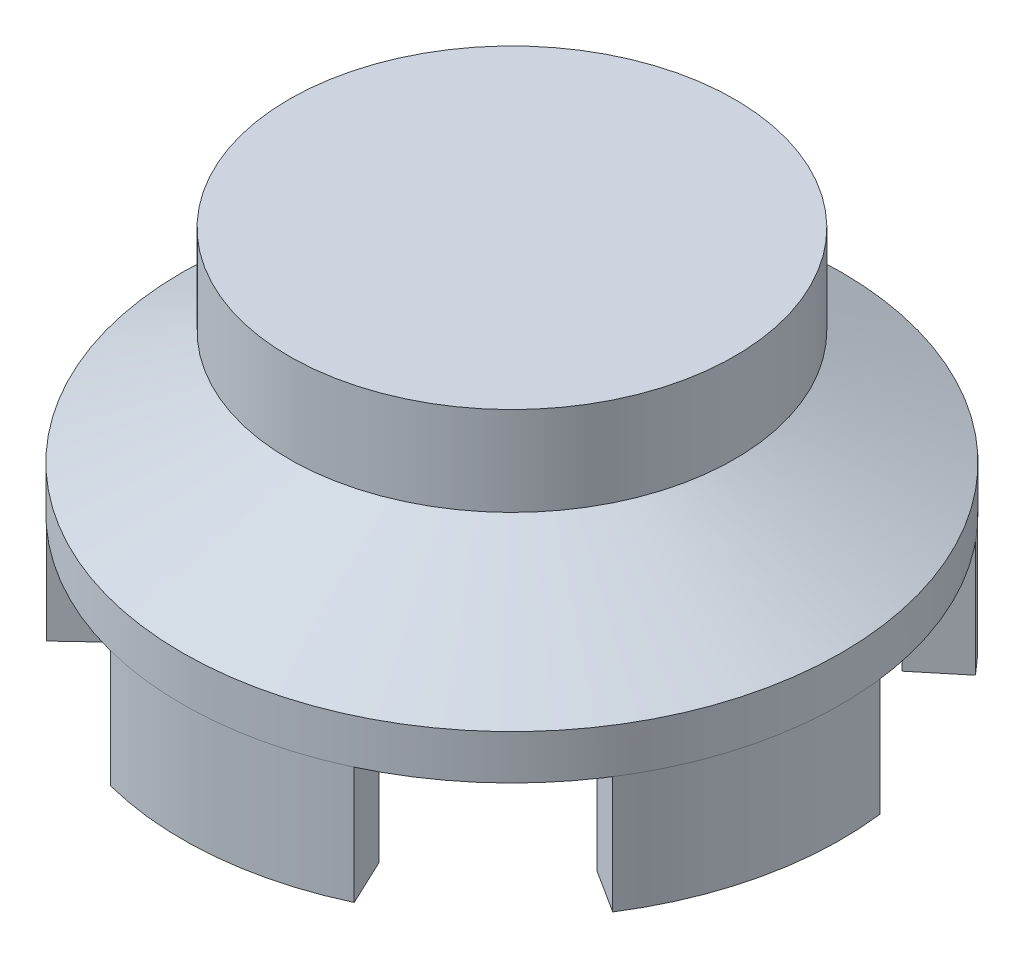
ISO-10303-21;
HEADER;
FILE_DESCRIPTION(('STEP AP214'),'2;1');
FILE_NAME('part.step','',(''),(''),'','','');
FILE_SCHEMA(('AUTOMOTIVE_DESIGN { 1 0 10303 214 1 1 1 1 }'));
ENDSEC;
DATA;
#1=APPLICATION_CONTEXT('core data for automotive mechanical design processes');
#2=APPLICATION_PROTOCOL_DEFINITION('international standard','automotive_design',2000,#1);
#3=PRODUCT_CONTEXT('',#1,'mechanical');
#4=PRODUCT('Part','Part','',(#3));
#5=PRODUCT_RELATED_PRODUCT_CATEGORY('part','',(#4));
#6=PRODUCT_DEFINITION_FORMATION('','',#4);
#7=PRODUCT_DEFINITION_CONTEXT('part definition',#1,'design');
#8=PRODUCT_DEFINITION('design','',#6,#7);
#9=PRODUCT_DEFINITION_SHAPE('','',#8);
#10=(LENGTH_UNIT() NAMED_UNIT(*) SI_UNIT(.MILLI.,.METRE.));
#11=(NAMED_UNIT(*) PLANE_ANGLE_UNIT() SI_UNIT($,.RADIAN.));
#12=(NAMED_UNIT(*) SI_UNIT($,.STERADIAN.) SOLID_ANGLE_UNIT());
#13=UNCERTAINTY_MEASURE_WITH_UNIT(LENGTH_MEASURE(1.E-05),#10,'distance_accuracy_value','');
#14=(GEOMETRIC_REPRESENTATION_CONTEXT(3) GLOBAL_UNCERTAINTY_ASSIGNED_CONTEXT((#13)) GLOBAL_UNIT_ASSIGNED_CONTEXT((#10,
#11,#12)) REPRESENTATION_CONTEXT('',''));
#15=CARTESIAN_POINT('',(0.,0.,0.));
#16=DIRECTION('',(0.,0.,1.));
#17=DIRECTION('',(1.,0.,0.));
#18=AXIS2_PLACEMENT_3D('',#15,#16,#17);
#19=CARTESIAN_POINT('',(15.5,-2.75793650793651,0.));
#20=DIRECTION('',(0.,1.,0.));
#21=DIRECTION('',(-1.,0.,0.));
#22=AXIS2_PLACEMENT_3D('',#19,#20,#21);
#23=PLANE('',#22);
#24=CARTESIAN_POINT('',(0.,-2.75793650793651,0.));
#25=DIRECTION('',(0.,1.,0.));
#26=DIRECTION('',(-1.,0.,0.));
#27=AXIS2_PLACEMENT_3D('',#24,#25,#26);
#28=CIRCLE('',#27,18.4844813235458);
#29=CARTESIAN_POINT('',(-16.1987932347149,-2.75793650793651,-8.90365922188551));
#30=VERTEX_POINT('',#29);
#31=CARTESIAN_POINT('',(-6.77439666234866,-2.75793650793651,-17.1983603771311));
#32=VERTEX_POINT('',#31);
#33=EDGE_CURVE('E336',#30,#32,#28,.F.);
#34=ORIENTED_EDGE('',*,*,#33,.F.);
#35=DIRECTION('',(-0.87634556529756,0.,-0.481682935324991));
#36=VECTOR('',#35,1.);
#37=CARTESIAN_POINT('',(11.9037140221589,-2.75793650793651,6.54287091589929));
#38=LINE('',#37,#36);
#39=CARTESIAN_POINT('',(-13.6383140461064,-2.75793650793651,-7.49629301813378));
#40=VERTEX_POINT('',#39);
#41=EDGE_CURVE('E327',#40,#30,#38,.T.);
#42=ORIENTED_EDGE('',*,*,#41,.F.);
#43=CARTESIAN_POINT('',(0.,-2.75793650793651,0.));
#44=DIRECTION('',(0.,1.,0.));
#45=DIRECTION('',(-1.,0.,0.));
#46=AXIS2_PLACEMENT_3D('',#43,#44,#45);
#47=CIRCLE('',#46,15.5627124574717);
#48=CARTESIAN_POINT('',(-5.70359457123055,-2.75793650793651,-14.4798835631014));
#49=VERTEX_POINT('',#48);
#50=EDGE_CURVE('E330',#49,#40,#47,.T.);
#51=ORIENTED_EDGE('',*,*,#50,.F.);
#52=DIRECTION('',(0.366491033411867,0.,0.930421583170071));
#53=VECTOR('',#52,1.);
#54=CARTESIAN_POINT('',(2.08189300235512,-2.75793650793651,5.28536309663293));
#55=LINE('',#54,#53);
#56=EDGE_CURVE('E333',#32,#49,#55,.T.);
#57=ORIENTED_EDGE('',*,*,#56,.F.);
#58=EDGE_LOOP('',(#34,#42,#51,#57));
#59=FACE_BOUND('',#58,.T.);
#60=CARTESIAN_POINT('',(0.,-2.75793650793651,0.));
#61=DIRECTION('',(0.,1.,0.));
#62=DIRECTION('',(-1.,0.,0.));
#63=AXIS2_PLACEMENT_3D('',#60,#61,#62);
#64=CIRCLE('',#63,18.4844813235458);
#65=CARTESIAN_POINT('',(18.3385385973125,-2.75793650793651,-2.31820014567192));
#66=VERTEX_POINT('',#65);
#67=CARTESIAN_POINT('',(15.5895446197659,-2.75793650793651,9.93187536917588));
#68=VERTEX_POINT('',#67);
#69=EDGE_CURVE('E312',#66,#68,#64,.F.);
#70=ORIENTED_EDGE('',*,*,#69,.F.);
#71=DIRECTION('',(0.992104580935825,0.,-0.12541331861549));
#72=VECTOR('',#71,1.);
#73=CARTESIAN_POINT('',(15.2562082424647,-2.75793650793651,-1.92855848258627));
#74=LINE('',#73,#72);
#75=CARTESIAN_POINT('',(15.4398383208447,-2.75793650793651,-1.95177141595016));
#76=VERTEX_POINT('',#75);
#77=EDGE_CURVE('E303',#76,#66,#74,.T.);
#78=ORIENTED_EDGE('',*,*,#77,.F.);
#79=CARTESIAN_POINT('',(0.,-2.75793650793651,0.));
#80=DIRECTION('',(0.,1.,0.));
#81=DIRECTION('',(-1.,0.,0.));
#82=AXIS2_PLACEMENT_3D('',#79,#80,#81);
#83=CIRCLE('',#82,15.5627124574717);
#84=CARTESIAN_POINT('',(13.1253669504534,-2.75793650793651,8.36198310509478));
#85=VERTEX_POINT('',#84);
#86=EDGE_CURVE('E306',#85,#76,#83,.T.);
#87=ORIENTED_EDGE('',*,*,#86,.F.);
#88=DIRECTION('',(-0.84338555931822,0.,-0.537308848180907));
#89=VECTOR('',#88,1.);
#90=CARTESIAN_POINT('',(11.0251376258309,-2.75793650793651,7.02395711347009));
#91=LINE('',#90,#89);
#92=EDGE_CURVE('E309',#68,#85,#91,.T.);
#93=ORIENTED_EDGE('',*,*,#92,.F.);
#94=EDGE_LOOP('',(#70,#78,#87,#93));
#95=FACE_BOUND('',#94,.T.);
#96=CARTESIAN_POINT('',(0.,-2.75793650793651,0.));
#97=DIRECTION('',(0.,1.,0.));
#98=DIRECTION('',(-1.,0.,0.));
#99=AXIS2_PLACEMENT_3D('',#96,#97,#98);
#100=CIRCLE('',#99,15.5);
#101=CARTESIAN_POINT('',(15.5,-2.75793650793651,0.));
#102=VERTEX_POINT('',#101);
#103=EDGE_CURVE('E285',#102,#102,#100,.T.);
#104=ORIENTED_EDGE('',*,*,#103,.T.);
#105=EDGE_LOOP('',(#104));
#106=FACE_BOUND('',#105,.T.);
#107=CARTESIAN_POINT('',(0.,-2.75793650793651,0.));
#108=DIRECTION('',(0.,1.,0.));
#109=DIRECTION('',(-1.,0.,0.));
#110=AXIS2_PLACEMENT_3D('',#107,#108,#109);
#111=CIRCLE('',#110,18.5);
#112=CARTESIAN_POINT('',(-18.5,-2.75793650793651,0.));
#113=VERTEX_POINT('',#112);
#114=EDGE_CURVE('E282',#113,#113,#111,.T.);
#115=ORIENTED_EDGE('',*,*,#114,.F.);
#116=EDGE_LOOP('',(#115));
#117=FACE_BOUND('',#116,.T.);
#118=CARTESIAN_POINT('',(0.,-2.75793650793651,0.));
#119=DIRECTION('',(0.,1.,0.));
#120=DIRECTION('',(-1.,0.,0.));
#121=AXIS2_PLACEMENT_3D('',#118,#119,#120);
#122=CIRCLE('',#121,18.4844813235458);
#123=CARTESIAN_POINT('',(7.87165943318813,-2.75793650793651,16.7246233909291));
#124=VERTEX_POINT('',#123);
#125=CARTESIAN_POINT('',(-4.62834056681188,-2.75793650793651,17.8956562717917));
#126=VERTEX_POINT('',#125);
#127=EDGE_CURVE('E300',#124,#126,#122,.F.);
#128=ORIENTED_EDGE('',*,*,#127,.F.);
#129=DIRECTION('',(0.425852329605868,0.,0.904792679772143));
#130=VECTOR('',#129,1.);
#131=CARTESIAN_POINT('',(2.81092820277654,-2.75793650793651,5.97227509261519));
#132=LINE('',#131,#130);
#133=CARTESIAN_POINT('',(6.62741735500058,-2.75793650793651,14.0810283089191));
#134=VERTEX_POINT('',#133);
#135=EDGE_CURVE('E291',#134,#124,#132,.T.);
#136=ORIENTED_EDGE('',*,*,#135,.F.);
#137=CARTESIAN_POINT('',(0.,-2.75793650793651,0.));
#138=DIRECTION('',(0.,1.,0.));
#139=DIRECTION('',(-1.,0.,0.));
#140=AXIS2_PLACEMENT_3D('',#137,#138,#139);
#141=CIRCLE('',#140,15.5627124574717);
#142=CARTESIAN_POINT('',(-3.89675707615299,-2.75793650793651,15.0669606531442));
#143=VERTEX_POINT('',#142);
#144=EDGE_CURVE('E294',#143,#134,#141,.T.);
#145=ORIENTED_EDGE('',*,*,#144,.F.);
#146=DIRECTION('',(0.250390610685745,0.,-0.968144897254755));
#147=VECTOR('',#146,1.);
#148=CARTESIAN_POINT('',(0.971779597753498,-2.75793650793651,-3.75742307686654));
#149=LINE('',#148,#147);
#150=EDGE_CURVE('E297',#126,#143,#149,.T.);
#151=ORIENTED_EDGE('',*,*,#150,.F.);
#152=EDGE_LOOP('',(#128,#136,#145,#151));
#153=FACE_BOUND('',#152,.T.);
#154=CARTESIAN_POINT('',(0.,-2.75793650793651,0.));
#155=DIRECTION('',(0.,1.,0.));
#156=DIRECTION('',(-1.,0.,0.));
#157=AXIS2_PLACEMENT_3D('',#154,#155,#156);
#158=CIRCLE('',#157,18.4844813235458);
#159=CARTESIAN_POINT('',(3.46218072395281,-2.75793650793651,-18.1573498736793));
#160=VERTEX_POINT('',#159);
#161=CARTESIAN_POINT('',(14.2632090109602,-2.75793650793651,-11.7574197216131));
#162=VERTEX_POINT('',#161);
#163=EDGE_CURVE('E324',#160,#162,#158,.F.);
#164=ORIENTED_EDGE('',*,*,#163,.F.);
#165=DIRECTION('',(0.187302021806944,0.,-0.982302373318436));
#166=VECTOR('',#165,1.);
#167=CARTESIAN_POINT('',(0.543771734281015,-2.75793650793651,-2.85180191849868));
#168=LINE('',#167,#166);
#169=CARTESIAN_POINT('',(2.91492750808456,-2.75793650793651,-15.2872893822468));
#170=VERTEX_POINT('',#169);
#171=EDGE_CURVE('E315',#170,#160,#168,.T.);
#172=ORIENTED_EDGE('',*,*,#171,.F.);
#173=CARTESIAN_POINT('',(0.,-2.75793650793651,0.));
#174=DIRECTION('',(0.,1.,0.));
#175=DIRECTION('',(-1.,0.,0.));
#176=AXIS2_PLACEMENT_3D('',#173,#174,#175);
#177=CIRCLE('',#176,15.5627124574717);
#178=CARTESIAN_POINT('',(12.0086799663478,-2.75793650793651,-9.89897088084328));
#179=VERTEX_POINT('',#178);
#180=EDGE_CURVE('E318',#179,#170,#177,.T.);
#181=ORIENTED_EDGE('',*,*,#180,.F.);
#182=DIRECTION('',(-0.771631551965245,0.,0.636069766622897));
#183=VECTOR('',#182,1.);
#184=CARTESIAN_POINT('',(9.22893640581855,-2.75793650793651,-7.60757826824966));
#185=LINE('',#184,#183);
#186=EDGE_CURVE('E321',#162,#179,#185,.T.);
#187=ORIENTED_EDGE('',*,*,#186,.F.);
#188=EDGE_LOOP('',(#164,#172,#181,#187));
#189=FACE_BOUND('',#188,.T.);
#190=CARTESIAN_POINT('',(0.,-2.75793650793651,0.));
#191=DIRECTION('',(0.,1.,0.));
#192=DIRECTION('',(-1.,0.,0.));
#193=AXIS2_PLACEMENT_3D('',#190,#191,#192);
#194=CIRCLE('',#193,18.4844813235458);
#195=CARTESIAN_POINT('',(-13.4735855197385,-2.75793650793651,12.6545858503076));
#196=VERTEX_POINT('',#195);
#197=CARTESIAN_POINT('',(-18.4500164015655,-2.75793650793651,1.1282484577766));
#198=VERTEX_POINT('',#197);
#199=EDGE_CURVE('E11',#196,#198,#194,.F.);
#200=ORIENTED_EDGE('',*,*,#199,.F.);
#201=DIRECTION('',(-0.728913367051076,0.,0.684605947486774));
#202=VECTOR('',#201,1.);
#203=CARTESIAN_POINT('',(8.23537779831892,-2.75793650793651,-7.73478560742953));
#204=LINE('',#203,#202);
#205=CARTESIAN_POINT('',(-11.3438691378234,-2.75793650793651,10.6543255074116));
#206=VERTEX_POINT('',#205);
#207=EDGE_CURVE('E339',#206,#196,#204,.T.);
#208=ORIENTED_EDGE('',*,*,#207,.F.);
#209=CARTESIAN_POINT('',(0.,-2.75793650793651,0.));
#210=DIRECTION('',(0.,1.,0.));
#211=DIRECTION('',(-1.,0.,0.));
#212=AXIS2_PLACEMENT_3D('',#209,#210,#211);
#213=CIRCLE('',#212,15.5627124574717);
#214=CARTESIAN_POINT('',(-15.5336952694176,-2.75793650793651,0.949910685705674));
#215=VERTEX_POINT('',#214);
#216=EDGE_CURVE('E50',#215,#206,#213,.T.);
#217=ORIENTED_EDGE('',*,*,#216,.F.);
#218=DIRECTION('',(0.998135467185853,0.,-0.0610376043573058));
#219=VECTOR('',#218,1.);
#220=CARTESIAN_POINT('',(15.442253368242,-2.75793650793651,-0.94431886498681));
#221=LINE('',#220,#219);
#222=EDGE_CURVE('E40',#198,#215,#221,.T.);
#223=ORIENTED_EDGE('',*,*,#222,.F.);
#224=EDGE_LOOP('',(#200,#208,#217,#223));
#225=FACE_BOUND('',#224,.T.);
#226=ADVANCED_FACE('F32',(#59,#95,#106,#117,#153,#189,#225),#23,.F.);
#227=CARTESIAN_POINT('',(0.,3.15476190476191,0.));
#228=DIRECTION('',(0.,1.,0.));
#229=DIRECTION('',(-1.,0.,0.));
#230=AXIS2_PLACEMENT_3D('',#227,#228,#229);
#231=PLANE('',#230);
#232=CARTESIAN_POINT('',(0.,3.15476190476191,0.));
#233=DIRECTION('',(0.,1.,0.));
#234=DIRECTION('',(-1.,0.,0.));
#235=AXIS2_PLACEMENT_3D('',#232,#233,#234);
#236=CIRCLE('',#235,4.);
#237=CARTESIAN_POINT('',(4.,3.15476190476191,0.));
#238=VERTEX_POINT('',#237);
#239=EDGE_CURVE('E288',#238,#238,#236,.T.);
#240=ORIENTED_EDGE('',*,*,#239,.F.);
#241=EDGE_LOOP('',(#240));
#242=FACE_BOUND('',#241,.T.);
#243=ADVANCED_FACE('F34',(#242),#231,.F.);
#244=CARTESIAN_POINT('',(0.,3.15476190476191,0.));
#245=DIRECTION('',(0.,-1.,0.));
#246=DIRECTION('',(1.,0.,0.));
#247=AXIS2_PLACEMENT_3D('',#244,#245,#246);
#248=CONICAL_SURFACE('',#247,4.,1.09589473232274);
#249=CARTESIAN_POINT('',(15.5,-2.75793650793651,0.));
#250=CARTESIAN_POINT('',(15.3802083333333,-2.6963458994709,0.));
#251=CARTESIAN_POINT('',(15.2604166666667,-2.63475529100529,0.));
#252=CARTESIAN_POINT('',(15.0208333333333,-2.51157407407407,0.));
#253=CARTESIAN_POINT('',(14.9010416666667,-2.44998346560846,0.));
#254=CARTESIAN_POINT('',(14.6614583333333,-2.32680224867725,0.));
#255=CARTESIAN_POINT('',(14.5416666666667,-2.26521164021164,0.));
#256=CARTESIAN_POINT('',(14.3020833333333,-2.14203042328042,0.));
#257=CARTESIAN_POINT('',(14.1822916666667,-2.08043981481481,0.));
#258=CARTESIAN_POINT('',(13.9427083333333,-1.9572585978836,0.));
#259=CARTESIAN_POINT('',(13.8229166666667,-1.89566798941799,0.));
#260=CARTESIAN_POINT('',(13.5833333333333,-1.77248677248677,0.));
#261=CARTESIAN_POINT('',(13.4635416666667,-1.71089616402116,0.));
#262=CARTESIAN_POINT('',(13.2239583333333,-1.58771494708995,0.));
#263=CARTESIAN_POINT('',(13.1041666666667,-1.52612433862434,0.));
#264=CARTESIAN_POINT('',(12.8645833333333,-1.40294312169312,0.));
#265=CARTESIAN_POINT('',(12.7447916666667,-1.34135251322751,0.));
#266=CARTESIAN_POINT('',(12.5052083333333,-1.21817129629629,0.));
#267=CARTESIAN_POINT('',(12.3854166666667,-1.15658068783069,0.));
#268=CARTESIAN_POINT('',(12.1458333333333,-1.03339947089947,0.));
#269=CARTESIAN_POINT('',(12.0260416666667,-0.971808862433861,0.));
#270=CARTESIAN_POINT('',(11.7864583333333,-0.848627645502644,0.));
#271=CARTESIAN_POINT('',(11.6666666666667,-0.787037037037035,0.));
#272=CARTESIAN_POINT('',(11.4270833333333,-0.663855820105818,0.));
#273=CARTESIAN_POINT('',(11.3072916666667,-0.60226521164021,0.));
#274=CARTESIAN_POINT('',(11.0677083333333,-0.479083994708993,0.));
#275=CARTESIAN_POINT('',(10.9479166666667,-0.417493386243385,0.));
#276=CARTESIAN_POINT('',(10.7083333333333,-0.294312169312167,0.));
#277=CARTESIAN_POINT('',(10.5885416666667,-0.232721560846559,0.));
#278=CARTESIAN_POINT('',(10.3489583333333,-0.109540343915342,0.));
#279=CARTESIAN_POINT('',(10.2291666666667,-0.047949735449733,0.));
#280=CARTESIAN_POINT('',(9.98958333333333,0.075231481481484,0.));
#281=CARTESIAN_POINT('',(9.86979166666667,0.136822089947092,0.));
#282=CARTESIAN_POINT('',(9.63020833333333,0.260003306878309,0.));
#283=CARTESIAN_POINT('',(9.51041666666667,0.321593915343917,0.));
#284=CARTESIAN_POINT('',(9.27083333333333,0.444775132275134,0.));
#285=CARTESIAN_POINT('',(9.15104166666667,0.506365740740743,0.));
#286=CARTESIAN_POINT('',(8.91145833333333,0.62954695767196,0.));
#287=CARTESIAN_POINT('',(8.79166666666667,0.691137566137568,0.));
#288=CARTESIAN_POINT('',(8.55208333333333,0.814318783068785,0.));
#289=CARTESIAN_POINT('',(8.43229166666667,0.875909391534394,0.));
#290=CARTESIAN_POINT('',(8.19270833333333,0.999090608465611,0.));
#291=CARTESIAN_POINT('',(8.07291666666667,1.06068121693122,0.));
#292=CARTESIAN_POINT('',(7.83333333333333,1.18386243386244,0.));
#293=CARTESIAN_POINT('',(7.71354166666667,1.24545304232804,0.));
#294=CARTESIAN_POINT('',(7.47395833333333,1.36863425925926,0.));
#295=CARTESIAN_POINT('',(7.35416666666667,1.43022486772487,0.));
#296=CARTESIAN_POINT('',(7.11458333333333,1.55340608465609,0.));
#297=CARTESIAN_POINT('',(6.99479166666667,1.6149966931217,0.));
#298=CARTESIAN_POINT('',(6.75520833333333,1.73817791005291,0.));
#299=CARTESIAN_POINT('',(6.63541666666667,1.79976851851852,0.));
#300=CARTESIAN_POINT('',(6.39583333333333,1.92294973544974,0.));
#301=CARTESIAN_POINT('',(6.27604166666667,1.98454034391535,0.));
#302=CARTESIAN_POINT('',(6.03645833333333,2.10772156084656,0.));
#303=CARTESIAN_POINT('',(5.91666666666667,2.16931216931217,0.));
#304=CARTESIAN_POINT('',(5.67708333333333,2.29249338624339,0.));
#305=CARTESIAN_POINT('',(5.55729166666667,2.354083994709,0.));
#306=CARTESIAN_POINT('',(5.31770833333333,2.47726521164022,0.));
#307=CARTESIAN_POINT('',(5.19791666666667,2.53885582010582,0.));
#308=CARTESIAN_POINT('',(4.95833333333333,2.66203703703704,0.));
#309=CARTESIAN_POINT('',(4.83854166666667,2.72362764550265,0.));
#310=CARTESIAN_POINT('',(4.59895833333333,2.84680886243387,0.));
#311=CARTESIAN_POINT('',(4.47916666666667,2.90839947089947,0.));
#312=CARTESIAN_POINT('',(4.23958333333333,3.03158068783069,0.));
#313=CARTESIAN_POINT('',(4.11979166666667,3.0931712962963,0.));
#314=CARTESIAN_POINT('',(4.,3.15476190476191,0.));
#315=B_SPLINE_CURVE_WITH_KNOTS('',3,(#249,#250,#251,#252,#253,#254,#255,#256,#257,#258,#259,
#260,#261,#262,#263,#264,#265,#266,#267,#268,#269,#270,#271,#272,#273,#274,#275,#276,#277,#278,
#279,#280,#281,#282,#283,#284,#285,#286,#287,#288,#289,#290,#291,#292,#293,#294,#295,#296,#297,
#298,#299,#300,#301,#302,#303,#304,#305,#306,#307,#308,#309,#310,#311,#312,#313,#314),
.UNSPECIFIED.,.F.,.F.,(4,2,2,2,2,2,2,2,2,2,2,2,2,2,2,2,2,2,2,2,2,2,2,2,2,2,2,2,2,2,2,2,4),(0.,
0.404092833499278,0.808185666998554,1.21227850049783,1.61637133399711,2.02046416749639,
2.42455700099567,2.82864983449494,3.23274266799422,3.6368355014935,4.04092833499278,
4.44502116849205,4.84911400199133,5.25320683549061,5.65729966898989,6.06139250248917,
6.46548533598844,6.86957816948772,7.273671002987,7.67776383648628,8.08185666998556,
8.48594950348483,8.89004233698411,9.29413517048339,9.69822800398267,10.1023208374819,
10.5064136709812,10.9105065044805,11.3145993379798,11.7186921714791,12.1227850049783,
12.5268778384776,12.9309706719769),.UNSPECIFIED.);
#316=EDGE_CURVE('BSEAM358',#102,#238,#315,.T.);
#317=ORIENTED_EDGE('',*,*,#103,.F.);
#318=ORIENTED_EDGE('',*,*,#239,.T.);
#319=ORIENTED_EDGE('',*,*,#316,.T.);
#320=ORIENTED_EDGE('',*,*,#316,.F.);
#321=EDGE_LOOP('',(#317,#319,#318,#320));
#322=FACE_BOUND('',#321,.T.);
#323=ADVANCED_FACE('F358',(#322),#248,.F.);
#324=CARTESIAN_POINT('',(0.,6.15476190476191,0.));
#325=DIRECTION('',(0.,1.,0.));
#326=DIRECTION('',(-1.,0.,0.));
#327=AXIS2_PLACEMENT_3D('',#324,#325,#326);
#328=CYLINDRICAL_SURFACE('',#327,18.5);
#329=CARTESIAN_POINT('',(0.,-0.257936507936507,0.));
#330=DIRECTION('',(0.,1.,0.));
#331=DIRECTION('',(-1.,0.,0.));
#332=AXIS2_PLACEMENT_3D('',#329,#330,#331);
#333=CIRCLE('',#332,18.5);
#334=CARTESIAN_POINT('',(18.5,-0.257936507936507,0.));
#335=VERTEX_POINT('',#334);
#336=EDGE_CURVE('E279',#335,#335,#333,.T.);
#337=ORIENTED_EDGE('',*,*,#336,.F.);
#338=EDGE_LOOP('',(#337));
#339=FACE_BOUND('',#338,.T.);
#340=ORIENTED_EDGE('',*,*,#114,.T.);
#341=EDGE_LOOP('',(#340));
#342=FACE_BOUND('',#341,.T.);
#343=ADVANCED_FACE('F362',(#339,#342),#328,.T.);
#344=CARTESIAN_POINT('',(0.,-0.257936507936507,0.));
#345=DIRECTION('',(0.,-1.,0.));
#346=DIRECTION('',(1.,0.,0.));
#347=AXIS2_PLACEMENT_3D('',#344,#345,#346);
#348=CONICAL_SURFACE('',#347,18.5,1.14517443063724);
#349=CARTESIAN_POINT('',(0.,6.15476190476191,0.));
#350=DIRECTION('',(0.,1.,0.));
#351=DIRECTION('',(-1.,0.,0.));
#352=AXIS2_PLACEMENT_3D('',#349,#350,#351);
#353=CIRCLE('',#352,4.35432021326643);
#354=CARTESIAN_POINT('',(4.35432021326643,6.15476190476191,0.));
#355=VERTEX_POINT('',#354);
#356=EDGE_CURVE('E276',#355,#355,#353,.T.);
#357=CARTESIAN_POINT('',(4.35432021326643,6.15476190476191,0.));
#358=CARTESIAN_POINT('',(4.50167104437824,6.08796296296297,0.));
#359=CARTESIAN_POINT('',(4.64902187549004,6.02116402116402,0.));
#360=CARTESIAN_POINT('',(4.94372353771366,5.88756613756614,0.));
#361=CARTESIAN_POINT('',(5.09107436882547,5.8207671957672,0.));
#362=CARTESIAN_POINT('',(5.38577603104908,5.68716931216932,0.));
#363=CARTESIAN_POINT('',(5.53312686216089,5.62037037037037,0.));
#364=CARTESIAN_POINT('',(5.82782852438451,5.48677248677249,0.));
#365=CARTESIAN_POINT('',(5.97517935549632,5.41997354497355,0.));
#366=CARTESIAN_POINT('',(6.26988101771993,5.28637566137567,0.));
#367=CARTESIAN_POINT('',(6.41723184883174,5.21957671957672,0.));
#368=CARTESIAN_POINT('',(6.71193351105536,5.08597883597884,0.));
#369=CARTESIAN_POINT('',(6.85928434216717,5.0191798941799,0.));
#370=CARTESIAN_POINT('',(7.15398600439078,4.88558201058201,0.));
#371=CARTESIAN_POINT('',(7.30133683550259,4.81878306878307,0.));
#372=CARTESIAN_POINT('',(7.59603849772621,4.68518518518519,0.));
#373=CARTESIAN_POINT('',(7.74338932883801,4.61838624338625,0.));
#374=CARTESIAN_POINT('',(8.03809099106163,4.48478835978836,0.));
#375=CARTESIAN_POINT('',(8.18544182217344,4.41798941798942,0.));
#376=CARTESIAN_POINT('',(8.48014348439705,4.28439153439154,0.));
#377=CARTESIAN_POINT('',(8.62749431550886,4.2175925925926,0.));
#378=CARTESIAN_POINT('',(8.92219597773248,4.08399470899471,0.));
#379=CARTESIAN_POINT('',(9.06954680884429,4.01719576719577,0.));
#380=CARTESIAN_POINT('',(9.3642484710679,3.88359788359789,0.));
#381=CARTESIAN_POINT('',(9.51159930217971,3.81679894179894,0.));
#382=CARTESIAN_POINT('',(9.80630096440333,3.68320105820106,0.));
#383=CARTESIAN_POINT('',(9.95365179551514,3.61640211640212,0.));
#384=CARTESIAN_POINT('',(10.2483534577388,3.48280423280424,0.));
#385=CARTESIAN_POINT('',(10.3957042888506,3.41600529100529,0.));
#386=CARTESIAN_POINT('',(10.6904059510742,3.28240740740741,0.));
#387=CARTESIAN_POINT('',(10.837756782186,3.21560846560847,0.));
#388=CARTESIAN_POINT('',(11.1324584444096,3.08201058201058,0.));
#389=CARTESIAN_POINT('',(11.2798092755214,3.01521164021164,0.));
#390=CARTESIAN_POINT('',(11.574510937745,2.88161375661376,0.));
#391=CARTESIAN_POINT('',(11.7218617688568,2.81481481481482,0.));
#392=CARTESIAN_POINT('',(12.0165634310804,2.68121693121693,0.));
#393=CARTESIAN_POINT('',(12.1639142621923,2.61441798941799,0.));
#394=CARTESIAN_POINT('',(12.4586159244159,2.48082010582011,0.));
#395=CARTESIAN_POINT('',(12.6059667555277,2.41402116402117,0.));
#396=CARTESIAN_POINT('',(12.9006684177513,2.28042328042328,0.));
#397=CARTESIAN_POINT('',(13.0480192488631,2.21362433862434,0.));
#398=CARTESIAN_POINT('',(13.3427209110867,2.08002645502646,0.));
#399=CARTESIAN_POINT('',(13.4900717421985,2.01322751322752,0.));
#400=CARTESIAN_POINT('',(13.7847734044221,1.87962962962963,0.));
#401=CARTESIAN_POINT('',(13.932124235534,1.81283068783069,0.));
#402=CARTESIAN_POINT('',(14.2268258977576,1.67923280423281,0.));
#403=CARTESIAN_POINT('',(14.3741767288694,1.61243386243386,0.));
#404=CARTESIAN_POINT('',(14.668878391093,1.47883597883598,0.));
#405=CARTESIAN_POINT('',(14.8162292222048,1.41203703703704,0.));
#406=CARTESIAN_POINT('',(15.1109308844284,1.27843915343916,0.));
#407=CARTESIAN_POINT('',(15.2582817155402,1.21164021164021,0.));
#408=CARTESIAN_POINT('',(15.5529833777638,1.07804232804233,0.));
#409=CARTESIAN_POINT('',(15.7003342088756,1.01124338624339,0.));
#410=CARTESIAN_POINT('',(15.9950358710993,0.877645502645504,0.));
#411=CARTESIAN_POINT('',(16.1423867022111,0.810846560846562,0.));
#412=CARTESIAN_POINT('',(16.4370883644347,0.677248677248679,0.));
#413=CARTESIAN_POINT('',(16.5844391955465,0.610449735449737,0.));
#414=CARTESIAN_POINT('',(16.8791408577701,0.476851851851853,0.));
#415=CARTESIAN_POINT('',(17.0264916888819,0.410052910052912,0.));
#416=CARTESIAN_POINT('',(17.3211933511055,0.276455026455028,0.));
#417=CARTESIAN_POINT('',(17.4685441822173,0.209656084656086,0.));
#418=CARTESIAN_POINT('',(17.763245844441,0.076058201058202,0.));
#419=CARTESIAN_POINT('',(17.9105966755528,0.00925925925926038,0.));
#420=CARTESIAN_POINT('',(18.2052983377764,-0.124338624338623,0.));
#421=CARTESIAN_POINT('',(18.3526491688882,-0.191137566137565,0.));
#422=CARTESIAN_POINT('',(18.5,-0.257936507936507,0.));
#423=B_SPLINE_CURVE_WITH_KNOTS('',3,(#357,#358,#359,#360,#361,#362,#363,#364,#365,#366,#367,
#368,#369,#370,#371,#372,#373,#374,#375,#376,#377,#378,#379,#380,#381,#382,#383,#384,#385,#386,
#387,#388,#389,#390,#391,#392,#393,#394,#395,#396,#397,#398,#399,#400,#401,#402,#403,#404,#405,
#406,#407,#408,#409,#410,#411,#412,#413,#414,#415,#416,#417,#418,#419,#420,#421,#422),
.UNSPECIFIED.,.F.,.F.,(4,2,2,2,2,2,2,2,2,2,2,2,2,2,2,2,2,2,2,2,2,2,2,2,2,2,2,2,2,2,2,2,4),(0.,
0.485354812990653,0.970709625981304,1.45606443897196,1.94141925196261,2.42677406495326,
2.91212887794391,3.39748369093457,3.88283850392522,4.36819331691587,4.85354812990652,
5.33890294289718,5.82425775588783,6.30961256887848,6.79496738186913,7.28032219485978,
7.76567700785044,8.25103182084109,8.73638663383174,9.2217414468224,9.70709625981305,
10.1924510728037,10.6778058857944,11.163160698785,11.6485155117757,12.1338703247663,
12.619225137757,13.1045799507476,13.5899347637383,14.0752895767289,14.5606443897196,
15.0459992027102,15.5313540157009),.UNSPECIFIED.);
#424=EDGE_CURVE('BSEAM369',#355,#335,#423,.T.);
#425=ORIENTED_EDGE('',*,*,#356,.F.);
#426=ORIENTED_EDGE('',*,*,#336,.T.);
#427=ORIENTED_EDGE('',*,*,#424,.T.);
#428=ORIENTED_EDGE('',*,*,#424,.F.);
#429=EDGE_LOOP('',(#425,#427,#426,#428));
#430=FACE_BOUND('',#429,.T.);
#431=ADVANCED_FACE('F369',(#430),#348,.T.);
#432=CARTESIAN_POINT('',(0.,-9.34523809523809,0.));
#433=DIRECTION('',(0.,1.,0.));
#434=DIRECTION('',(-1.,0.,0.));
#435=AXIS2_PLACEMENT_3D('',#432,#433,#434);
#436=CYLINDRICAL_SURFACE('',#435,18.4844813235458);
#437=DIRECTION('',(0.,1.,0.));
#438=VECTOR('',#437,1.);
#439=CARTESIAN_POINT('',(7.87165943318813,-9.34523809523809,16.7246233909291));
#440=LINE('',#439,#438);
#441=CARTESIAN_POINT('',(7.87165943318813,-9.34523809523809,16.7246233909291));
#442=VERTEX_POINT('',#441);
#443=EDGE_CURVE('E264',#442,#124,#440,.T.);
#444=ORIENTED_EDGE('',*,*,#443,.T.);
#445=ORIENTED_EDGE('',*,*,#127,.T.);
#446=DIRECTION('',(0.,1.,0.));
#447=VECTOR('',#446,1.);
#448=CARTESIAN_POINT('',(-4.62834056681187,-9.34523809523809,17.8956562717917));
#449=LINE('',#448,#447);
#450=CARTESIAN_POINT('',(-4.62834056681187,-9.34523809523809,17.8956562717917));
#451=VERTEX_POINT('',#450);
#452=EDGE_CURVE('E273',#451,#126,#449,.T.);
#453=ORIENTED_EDGE('',*,*,#452,.F.);
#454=CARTESIAN_POINT('',(0.,-9.34523809523809,0.));
#455=DIRECTION('',(0.,-1.,0.));
#456=DIRECTION('',(1.,0.,0.));
#457=AXIS2_PLACEMENT_3D('',#454,#455,#456);
#458=CIRCLE('',#457,18.4844813235458);
#459=EDGE_CURVE('E255',#442,#451,#458,.T.);
#460=ORIENTED_EDGE('',*,*,#459,.F.);
#461=EDGE_LOOP('',(#444,#445,#453,#460));
#462=FACE_BOUND('',#461,.T.);
#463=ADVANCED_FACE('F441',(#462),#436,.T.);
#464=CARTESIAN_POINT('',(-4.62834056681187,-9.34523809523809,17.8956562717917));
#465=DIRECTION('',(0.968144897254755,0.,0.250390610685745));
#466=DIRECTION('',(0.250390610685745,0.,-0.968144897254755));
#467=AXIS2_PLACEMENT_3D('',#464,#465,#466);
#468=PLANE('',#467);
#469=ORIENTED_EDGE('',*,*,#452,.T.);
#470=ORIENTED_EDGE('',*,*,#150,.T.);
#471=DIRECTION('',(0.,1.,0.));
#472=VECTOR('',#471,1.);
#473=CARTESIAN_POINT('',(-3.89675707615299,-9.34523809523809,15.0669606531442));
#474=LINE('',#473,#472);
#475=CARTESIAN_POINT('',(-3.89675707615299,-9.34523809523809,15.0669606531442));
#476=VERTEX_POINT('',#475);
#477=EDGE_CURVE('E270',#476,#143,#474,.T.);
#478=ORIENTED_EDGE('',*,*,#477,.F.);
#479=DIRECTION('',(0.250390610685745,0.,-0.968144897254755));
#480=VECTOR('',#479,1.);
#481=CARTESIAN_POINT('',(-4.62834056681187,-9.34523809523809,17.8956562717917));
#482=LINE('',#481,#480);
#483=EDGE_CURVE('E258',#451,#476,#482,.T.);
#484=ORIENTED_EDGE('',*,*,#483,.F.);
#485=EDGE_LOOP('',(#469,#470,#478,#484));
#486=FACE_BOUND('',#485,.T.);
#487=ADVANCED_FACE('F437',(#486),#468,.F.);
#488=CARTESIAN_POINT('',(0.,-9.34523809523809,0.));
#489=DIRECTION('',(0.,1.,0.));
#490=DIRECTION('',(-1.,0.,0.));
#491=AXIS2_PLACEMENT_3D('',#488,#489,#490);
#492=CYLINDRICAL_SURFACE('',#491,15.5627124574717);
#493=ORIENTED_EDGE('',*,*,#477,.T.);
#494=ORIENTED_EDGE('',*,*,#144,.T.);
#495=DIRECTION('',(0.,1.,0.));
#496=VECTOR('',#495,1.);
#497=CARTESIAN_POINT('',(6.62741735500058,-9.34523809523809,14.0810283089191));
#498=LINE('',#497,#496);
#499=CARTESIAN_POINT('',(6.62741735500058,-9.34523809523809,14.0810283089191));
#500=VERTEX_POINT('',#499);
#501=EDGE_CURVE('E267',#500,#134,#498,.T.);
#502=ORIENTED_EDGE('',*,*,#501,.F.);
#503=CARTESIAN_POINT('',(0.,-9.34523809523809,0.));
#504=DIRECTION('',(0.,1.,0.));
#505=DIRECTION('',(1.,0.,0.));
#506=AXIS2_PLACEMENT_3D('',#503,#504,#505);
#507=CIRCLE('',#506,15.5627124574717);
#508=EDGE_CURVE('E260',#476,#500,#507,.T.);
#509=ORIENTED_EDGE('',*,*,#508,.F.);
#510=EDGE_LOOP('',(#493,#494,#502,#509));
#511=FACE_BOUND('',#510,.T.);
#512=ADVANCED_FACE('F433',(#511),#492,.F.);
#513=CARTESIAN_POINT('',(7.87165943318813,-9.34523809523809,16.7246233909291));
#514=DIRECTION('',(-0.904792679772143,0.,0.425852329605868));
#515=DIRECTION('',(0.425852329605868,0.,0.904792679772143));
#516=AXIS2_PLACEMENT_3D('',#513,#514,#515);
#517=PLANE('',#516);
#518=ORIENTED_EDGE('',*,*,#501,.T.);
#519=ORIENTED_EDGE('',*,*,#135,.T.);
#520=ORIENTED_EDGE('',*,*,#443,.F.);
#521=DIRECTION('',(0.425852329605868,0.,0.904792679772143));
#522=VECTOR('',#521,1.);
#523=CARTESIAN_POINT('',(7.87165943318813,-9.34523809523809,16.7246233909291));
#524=LINE('',#523,#522);
#525=EDGE_CURVE('E262',#500,#442,#524,.T.);
#526=ORIENTED_EDGE('',*,*,#525,.F.);
#527=EDGE_LOOP('',(#518,#519,#520,#526));
#528=FACE_BOUND('',#527,.T.);
#529=ADVANCED_FACE('F429',(#528),#517,.F.);
#530=CARTESIAN_POINT('',(0.,-9.34523809523809,0.));
#531=DIRECTION('',(0.,-1.,0.));
#532=DIRECTION('',(1.,0.,0.));
#533=AXIS2_PLACEMENT_3D('',#530,#531,#532);
#534=PLANE('',#533);
#535=ORIENTED_EDGE('',*,*,#459,.T.);
#536=ORIENTED_EDGE('',*,*,#483,.T.);
#537=ORIENTED_EDGE('',*,*,#508,.T.);
#538=ORIENTED_EDGE('',*,*,#525,.T.);
#539=EDGE_LOOP('',(#535,#536,#537,#538));
#540=FACE_BOUND('',#539,.T.);
#541=ADVANCED_FACE('F425',(#540),#534,.T.);
#542=CARTESIAN_POINT('',(0.,-9.34523809523809,0.));
#543=DIRECTION('',(0.,1.,0.));
#544=DIRECTION('',(-1.,0.,0.));
#545=AXIS2_PLACEMENT_3D('',#542,#543,#544);
#546=CYLINDRICAL_SURFACE('',#545,18.4844813235458);
#547=DIRECTION('',(0.,1.,0.));
#548=VECTOR('',#547,1.);
#549=CARTESIAN_POINT('',(18.3385385973125,-9.34523809523809,-2.31820014567192));
#550=LINE('',#549,#548);
#551=CARTESIAN_POINT('',(18.3385385973125,-9.34523809523809,-2.31820014567192));
#552=VERTEX_POINT('',#551);
#553=EDGE_CURVE('E243',#552,#66,#550,.T.);
#554=ORIENTED_EDGE('',*,*,#553,.T.);
#555=ORIENTED_EDGE('',*,*,#69,.T.);
#556=DIRECTION('',(0.,1.,0.));
#557=VECTOR('',#556,1.);
#558=CARTESIAN_POINT('',(15.5895446197659,-9.34523809523809,9.93187536917588));
#559=LINE('',#558,#557);
#560=CARTESIAN_POINT('',(15.5895446197659,-9.34523809523809,9.93187536917588));
#561=VERTEX_POINT('',#560);
#562=EDGE_CURVE('E252',#561,#68,#559,.T.);
#563=ORIENTED_EDGE('',*,*,#562,.F.);
#564=CARTESIAN_POINT('',(0.,-9.34523809523809,0.));
#565=DIRECTION('',(0.,-1.,0.));
#566=DIRECTION('',(1.,0.,0.));
#567=AXIS2_PLACEMENT_3D('',#564,#565,#566);
#568=CIRCLE('',#567,18.4844813235458);
#569=EDGE_CURVE('E234',#552,#561,#568,.T.);
#570=ORIENTED_EDGE('',*,*,#569,.F.);
#571=EDGE_LOOP('',(#554,#555,#563,#570));
#572=FACE_BOUND('',#571,.T.);
#573=ADVANCED_FACE('F421',(#572),#546,.T.);
#574=CARTESIAN_POINT('',(15.5895446197659,-9.34523809523809,9.93187536917588));
#575=DIRECTION('',(0.537308848180907,0.,-0.84338555931822));
#576=DIRECTION('',(-0.84338555931822,0.,-0.537308848180907));
#577=AXIS2_PLACEMENT_3D('',#574,#575,#576);
#578=PLANE('',#577);
#579=ORIENTED_EDGE('',*,*,#562,.T.);
#580=ORIENTED_EDGE('',*,*,#92,.T.);
#581=DIRECTION('',(0.,1.,0.));
#582=VECTOR('',#581,1.);
#583=CARTESIAN_POINT('',(13.1253669504534,-9.34523809523809,8.36198310509478));
#584=LINE('',#583,#582);
#585=CARTESIAN_POINT('',(13.1253669504534,-9.34523809523809,8.36198310509478));
#586=VERTEX_POINT('',#585);
#587=EDGE_CURVE('E249',#586,#85,#584,.T.);
#588=ORIENTED_EDGE('',*,*,#587,.F.);
#589=DIRECTION('',(-0.84338555931822,0.,-0.537308848180907));
#590=VECTOR('',#589,1.);
#591=CARTESIAN_POINT('',(15.5895446197659,-9.34523809523809,9.93187536917588));
#592=LINE('',#591,#590);
#593=EDGE_CURVE('E237',#561,#586,#592,.T.);
#594=ORIENTED_EDGE('',*,*,#593,.F.);
#595=EDGE_LOOP('',(#579,#580,#588,#594));
#596=FACE_BOUND('',#595,.T.);
#597=ADVANCED_FACE('F417',(#596),#578,.F.);
#598=CARTESIAN_POINT('',(0.,-9.34523809523809,0.));
#599=DIRECTION('',(0.,1.,0.));
#600=DIRECTION('',(-1.,0.,0.));
#601=AXIS2_PLACEMENT_3D('',#598,#599,#600);
#602=CYLINDRICAL_SURFACE('',#601,15.5627124574717);
#603=ORIENTED_EDGE('',*,*,#587,.T.);
#604=ORIENTED_EDGE('',*,*,#86,.T.);
#605=DIRECTION('',(0.,1.,0.));
#606=VECTOR('',#605,1.);
#607=CARTESIAN_POINT('',(15.4398383208447,-9.34523809523809,-1.95177141595016));
#608=LINE('',#607,#606);
#609=CARTESIAN_POINT('',(15.4398383208447,-9.34523809523809,-1.95177141595016));
#610=VERTEX_POINT('',#609);
#611=EDGE_CURVE('E246',#610,#76,#608,.T.);
#612=ORIENTED_EDGE('',*,*,#611,.F.);
#613=CARTESIAN_POINT('',(0.,-9.34523809523809,0.));
#614=DIRECTION('',(0.,1.,0.));
#615=DIRECTION('',(1.,0.,0.));
#616=AXIS2_PLACEMENT_3D('',#613,#614,#615);
#617=CIRCLE('',#616,15.5627124574717);
#618=EDGE_CURVE('E239',#586,#610,#617,.T.);
#619=ORIENTED_EDGE('',*,*,#618,.F.);
#620=EDGE_LOOP('',(#603,#604,#612,#619));
#621=FACE_BOUND('',#620,.T.);
#622=ADVANCED_FACE('F413',(#621),#602,.F.);
#623=CARTESIAN_POINT('',(18.3385385973125,-9.34523809523809,-2.31820014567192));
#624=DIRECTION('',(0.12541331861549,0.,0.992104580935825));
#625=DIRECTION('',(0.992104580935825,0.,-0.12541331861549));
#626=AXIS2_PLACEMENT_3D('',#623,#624,#625);
#627=PLANE('',#626);
#628=ORIENTED_EDGE('',*,*,#611,.T.);
#629=ORIENTED_EDGE('',*,*,#77,.T.);
#630=ORIENTED_EDGE('',*,*,#553,.F.);
#631=DIRECTION('',(0.992104580935825,0.,-0.12541331861549));
#632=VECTOR('',#631,1.);
#633=CARTESIAN_POINT('',(18.3385385973125,-9.34523809523809,-2.31820014567192));
#634=LINE('',#633,#632);
#635=EDGE_CURVE('E241',#610,#552,#634,.T.);
#636=ORIENTED_EDGE('',*,*,#635,.F.);
#637=EDGE_LOOP('',(#628,#629,#630,#636));
#638=FACE_BOUND('',#637,.T.);
#639=ADVANCED_FACE('F409',(#638),#627,.F.);
#640=CARTESIAN_POINT('',(0.,-9.34523809523809,0.));
#641=DIRECTION('',(0.,-1.,0.));
#642=DIRECTION('',(1.,0.,0.));
#643=AXIS2_PLACEMENT_3D('',#640,#641,#642);
#644=PLANE('',#643);
#645=ORIENTED_EDGE('',*,*,#569,.T.);
#646=ORIENTED_EDGE('',*,*,#593,.T.);
#647=ORIENTED_EDGE('',*,*,#618,.T.);
#648=ORIENTED_EDGE('',*,*,#635,.T.);
#649=EDGE_LOOP('',(#645,#646,#647,#648));
#650=FACE_BOUND('',#649,.T.);
#651=ADVANCED_FACE('F403',(#650),#644,.T.);
#652=CARTESIAN_POINT('',(0.,-9.34523809523809,0.));
#653=DIRECTION('',(0.,1.,0.));
#654=DIRECTION('',(-1.,0.,0.));
#655=AXIS2_PLACEMENT_3D('',#652,#653,#654);
#656=CYLINDRICAL_SURFACE('',#655,18.4844813235458);
#657=DIRECTION('',(0.,1.,0.));
#658=VECTOR('',#657,1.);
#659=CARTESIAN_POINT('',(3.46218072395281,-9.34523809523809,-18.1573498736793));
#660=LINE('',#659,#658);
#661=CARTESIAN_POINT('',(3.46218072395281,-9.34523809523809,-18.1573498736793));
#662=VERTEX_POINT('',#661);
#663=EDGE_CURVE('E222',#662,#160,#660,.T.);
#664=ORIENTED_EDGE('',*,*,#663,.T.);
#665=ORIENTED_EDGE('',*,*,#163,.T.);
#666=DIRECTION('',(0.,1.,0.));
#667=VECTOR('',#666,1.);
#668=CARTESIAN_POINT('',(14.2632090109602,-9.34523809523809,-11.7574197216131));
#669=LINE('',#668,#667);
#670=CARTESIAN_POINT('',(14.2632090109602,-9.34523809523809,-11.7574197216131));
#671=VERTEX_POINT('',#670);
#672=EDGE_CURVE('E231',#671,#162,#669,.T.);
#673=ORIENTED_EDGE('',*,*,#672,.F.);
#674=CARTESIAN_POINT('',(0.,-9.34523809523809,0.));
#675=DIRECTION('',(0.,-1.,0.));
#676=DIRECTION('',(1.,0.,0.));
#677=AXIS2_PLACEMENT_3D('',#674,#675,#676);
#678=CIRCLE('',#677,18.4844813235458);
#679=EDGE_CURVE('E213',#662,#671,#678,.T.);
#680=ORIENTED_EDGE('',*,*,#679,.F.);
#681=EDGE_LOOP('',(#664,#665,#673,#680));
#682=FACE_BOUND('',#681,.T.);
#683=ADVANCED_FACE('F387',(#682),#656,.T.);
#684=CARTESIAN_POINT('',(14.2632090109602,-9.34523809523809,-11.7574197216131));
#685=DIRECTION('',(-0.636069766622897,0.,-0.771631551965245));
#686=DIRECTION('',(-0.771631551965245,0.,0.636069766622897));
#687=AXIS2_PLACEMENT_3D('',#684,#685,#686);
#688=PLANE('',#687);
#689=ORIENTED_EDGE('',*,*,#672,.T.);
#690=ORIENTED_EDGE('',*,*,#186,.T.);
#691=DIRECTION('',(0.,1.,0.));
#692=VECTOR('',#691,1.);
#693=CARTESIAN_POINT('',(12.0086799663478,-9.34523809523809,-9.89897088084328));
#694=LINE('',#693,#692);
#695=CARTESIAN_POINT('',(12.0086799663478,-9.34523809523809,-9.89897088084328));
#696=VERTEX_POINT('',#695);
#697=EDGE_CURVE('E228',#696,#179,#694,.T.);
#698=ORIENTED_EDGE('',*,*,#697,.F.);
#699=DIRECTION('',(-0.771631551965245,0.,0.636069766622897));
#700=VECTOR('',#699,1.);
#701=CARTESIAN_POINT('',(14.2632090109602,-9.34523809523809,-11.7574197216131));
#702=LINE('',#701,#700);
#703=EDGE_CURVE('E216',#671,#696,#702,.T.);
#704=ORIENTED_EDGE('',*,*,#703,.F.);
#705=EDGE_LOOP('',(#689,#690,#698,#704));
#706=FACE_BOUND('',#705,.T.);
#707=ADVANCED_FACE('F395',(#706),#688,.F.);
#708=CARTESIAN_POINT('',(0.,-9.34523809523809,0.));
#709=DIRECTION('',(0.,1.,0.));
#710=DIRECTION('',(-1.,0.,0.));
#711=AXIS2_PLACEMENT_3D('',#708,#709,#710);
#712=CYLINDRICAL_SURFACE('',#711,15.5627124574717);
#713=ORIENTED_EDGE('',*,*,#697,.T.);
#714=ORIENTED_EDGE('',*,*,#180,.T.);
#715=DIRECTION('',(0.,1.,0.));
#716=VECTOR('',#715,1.);
#717=CARTESIAN_POINT('',(2.91492750808455,-9.34523809523809,-15.2872893822468));
#718=LINE('',#717,#716);
#719=CARTESIAN_POINT('',(2.91492750808455,-9.34523809523809,-15.2872893822468));
#720=VERTEX_POINT('',#719);
#721=EDGE_CURVE('E225',#720,#170,#718,.T.);
#722=ORIENTED_EDGE('',*,*,#721,.F.);
#723=CARTESIAN_POINT('',(0.,-9.34523809523809,0.));
#724=DIRECTION('',(0.,1.,0.));
#725=DIRECTION('',(1.,0.,0.));
#726=AXIS2_PLACEMENT_3D('',#723,#724,#725);
#727=CIRCLE('',#726,15.5627124574717);
#728=EDGE_CURVE('E218',#696,#720,#727,.T.);
#729=ORIENTED_EDGE('',*,*,#728,.F.);
#730=EDGE_LOOP('',(#713,#714,#722,#729));
#731=FACE_BOUND('',#730,.T.);
#732=ADVANCED_FACE('F393',(#731),#712,.F.);
#733=CARTESIAN_POINT('',(3.46218072395281,-9.34523809523809,-18.1573498736793));
#734=DIRECTION('',(0.982302373318436,0.,0.187302021806944));
#735=DIRECTION('',(0.187302021806944,0.,-0.982302373318436));
#736=AXIS2_PLACEMENT_3D('',#733,#734,#735);
#737=PLANE('',#736);
#738=ORIENTED_EDGE('',*,*,#721,.T.);
#739=ORIENTED_EDGE('',*,*,#171,.T.);
#740=ORIENTED_EDGE('',*,*,#663,.F.);
#741=DIRECTION('',(0.187302021806944,0.,-0.982302373318436));
#742=VECTOR('',#741,1.);
#743=CARTESIAN_POINT('',(3.46218072395281,-9.34523809523809,-18.1573498736793));
#744=LINE('',#743,#742);
#745=EDGE_CURVE('E220',#720,#662,#744,.T.);
#746=ORIENTED_EDGE('',*,*,#745,.F.);
#747=EDGE_LOOP('',(#738,#739,#740,#746));
#748=FACE_BOUND('',#747,.T.);
#749=ADVANCED_FACE('F383',(#748),#737,.F.);
#750=CARTESIAN_POINT('',(0.,-9.34523809523809,0.));
#751=DIRECTION('',(0.,-1.,0.));
#752=DIRECTION('',(1.,0.,0.));
#753=AXIS2_PLACEMENT_3D('',#750,#751,#752);
#754=PLANE('',#753);
#755=ORIENTED_EDGE('',*,*,#679,.T.);
#756=ORIENTED_EDGE('',*,*,#703,.T.);
#757=ORIENTED_EDGE('',*,*,#728,.T.);
#758=ORIENTED_EDGE('',*,*,#745,.T.);
#759=EDGE_LOOP('',(#755,#756,#757,#758));
#760=FACE_BOUND('',#759,.T.);
#761=ADVANCED_FACE('F389',(#760),#754,.T.);
#762=CARTESIAN_POINT('',(0.,-9.34523809523809,0.));
#763=DIRECTION('',(0.,1.,0.));
#764=DIRECTION('',(-1.,0.,0.));
#765=AXIS2_PLACEMENT_3D('',#762,#763,#764);
#766=CYLINDRICAL_SURFACE('',#765,18.4844813235458);
#767=DIRECTION('',(0.,1.,0.));
#768=VECTOR('',#767,1.);
#769=CARTESIAN_POINT('',(-16.1987932347149,-9.34523809523809,-8.90365922188551));
#770=LINE('',#769,#768);
#771=CARTESIAN_POINT('',(-16.1987932347149,-9.34523809523809,-8.90365922188551));
#772=VERTEX_POINT('',#771);
#773=EDGE_CURVE('E201',#772,#30,#770,.T.);
#774=ORIENTED_EDGE('',*,*,#773,.T.);
#775=ORIENTED_EDGE('',*,*,#33,.T.);
#776=DIRECTION('',(0.,1.,0.));
#777=VECTOR('',#776,1.);
#778=CARTESIAN_POINT('',(-6.77439666234866,-9.34523809523809,-17.1983603771311));
#779=LINE('',#778,#777);
#780=CARTESIAN_POINT('',(-6.77439666234866,-9.34523809523809,-17.1983603771311));
#781=VERTEX_POINT('',#780);
#782=EDGE_CURVE('E210',#781,#32,#779,.T.);
#783=ORIENTED_EDGE('',*,*,#782,.F.);
#784=CARTESIAN_POINT('',(0.,-9.34523809523809,0.));
#785=DIRECTION('',(0.,-1.,0.));
#786=DIRECTION('',(1.,0.,0.));
#787=AXIS2_PLACEMENT_3D('',#784,#785,#786);
#788=CIRCLE('',#787,18.4844813235458);
#789=EDGE_CURVE('E187',#772,#781,#788,.T.);
#790=ORIENTED_EDGE('',*,*,#789,.F.);
#791=EDGE_LOOP('',(#774,#775,#783,#790));
#792=FACE_BOUND('',#791,.T.);
#793=ADVANCED_FACE('F502',(#792),#766,.T.);
#794=CARTESIAN_POINT('',(-6.77439666234866,-9.34523809523809,-17.1983603771311));
#795=DIRECTION('',(-0.930421583170071,0.,0.366491033411867));
#796=DIRECTION('',(0.366491033411867,0.,0.930421583170071));
#797=AXIS2_PLACEMENT_3D('',#794,#795,#796);
#798=PLANE('',#797);
#799=ORIENTED_EDGE('',*,*,#782,.T.);
#800=ORIENTED_EDGE('',*,*,#56,.T.);
#801=DIRECTION('',(0.,1.,0.));
#802=VECTOR('',#801,1.);
#803=CARTESIAN_POINT('',(-5.70359457123055,-9.34523809523809,-14.4798835631014));
#804=LINE('',#803,#802);
#805=CARTESIAN_POINT('',(-5.70359457123055,-9.34523809523809,-14.4798835631014));
#806=VERTEX_POINT('',#805);
#807=EDGE_CURVE('E207',#806,#49,#804,.T.);
#808=ORIENTED_EDGE('',*,*,#807,.F.);
#809=DIRECTION('',(0.366491033411867,0.,0.930421583170071));
#810=VECTOR('',#809,1.);
#811=CARTESIAN_POINT('',(-6.77439666234866,-9.34523809523809,-17.1983603771311));
#812=LINE('',#811,#810);
#813=EDGE_CURVE('E190',#781,#806,#812,.T.);
#814=ORIENTED_EDGE('',*,*,#813,.F.);
#815=EDGE_LOOP('',(#799,#800,#808,#814));
#816=FACE_BOUND('',#815,.T.);
#817=ADVANCED_FACE('F498',(#816),#798,.F.);
#818=CARTESIAN_POINT('',(0.,-9.34523809523809,0.));
#819=DIRECTION('',(0.,1.,0.));
#820=DIRECTION('',(-1.,0.,0.));
#821=AXIS2_PLACEMENT_3D('',#818,#819,#820);
#822=CYLINDRICAL_SURFACE('',#821,15.5627124574717);
#823=ORIENTED_EDGE('',*,*,#807,.T.);
#824=ORIENTED_EDGE('',*,*,#50,.T.);
#825=DIRECTION('',(0.,1.,0.));
#826=VECTOR('',#825,1.);
#827=CARTESIAN_POINT('',(-13.6383140461064,-9.34523809523809,-7.49629301813378));
#828=LINE('',#827,#826);
#829=CARTESIAN_POINT('',(-13.6383140461064,-9.34523809523809,-7.49629301813378));
#830=VERTEX_POINT('',#829);
#831=EDGE_CURVE('E204',#830,#40,#828,.T.);
#832=ORIENTED_EDGE('',*,*,#831,.F.);
#833=CARTESIAN_POINT('',(0.,-9.34523809523809,0.));
#834=DIRECTION('',(0.,1.,0.));
#835=DIRECTION('',(1.,0.,0.));
#836=AXIS2_PLACEMENT_3D('',#833,#834,#835);
#837=CIRCLE('',#836,15.5627124574717);
#838=EDGE_CURVE('E197',#806,#830,#837,.T.);
#839=ORIENTED_EDGE('',*,*,#838,.F.);
#840=EDGE_LOOP('',(#823,#824,#832,#839));
#841=FACE_BOUND('',#840,.T.);
#842=ADVANCED_FACE('F494',(#841),#822,.F.);
#843=CARTESIAN_POINT('',(-16.1987932347149,-9.34523809523809,-8.90365922188551));
#844=DIRECTION('',(0.481682935324991,0.,-0.87634556529756));
#845=DIRECTION('',(-0.87634556529756,0.,-0.481682935324991));
#846=AXIS2_PLACEMENT_3D('',#843,#844,#845);
#847=PLANE('',#846);
#848=ORIENTED_EDGE('',*,*,#831,.T.);
#849=ORIENTED_EDGE('',*,*,#41,.T.);
#850=ORIENTED_EDGE('',*,*,#773,.F.);
#851=DIRECTION('',(-0.87634556529756,0.,-0.481682935324991));
#852=VECTOR('',#851,1.);
#853=CARTESIAN_POINT('',(-16.1987932347149,-9.34523809523809,-8.90365922188551));
#854=LINE('',#853,#852);
#855=EDGE_CURVE('E199',#830,#772,#854,.T.);
#856=ORIENTED_EDGE('',*,*,#855,.F.);
#857=EDGE_LOOP('',(#848,#849,#850,#856));
#858=FACE_BOUND('',#857,.T.);
#859=ADVANCED_FACE('F490',(#858),#847,.F.);
#860=CARTESIAN_POINT('',(0.,-9.34523809523809,0.));
#861=DIRECTION('',(0.,-1.,0.));
#862=DIRECTION('',(1.,0.,0.));
#863=AXIS2_PLACEMENT_3D('',#860,#861,#862);
#864=PLANE('',#863);
#865=ORIENTED_EDGE('',*,*,#789,.T.);
#866=ORIENTED_EDGE('',*,*,#813,.T.);
#867=ORIENTED_EDGE('',*,*,#838,.T.);
#868=ORIENTED_EDGE('',*,*,#855,.T.);
#869=EDGE_LOOP('',(#865,#866,#867,#868));
#870=FACE_BOUND('',#869,.T.);
#871=ADVANCED_FACE('F487',(#870),#864,.T.);
#872=CARTESIAN_POINT('',(0.,-9.34523809523809,0.));
#873=DIRECTION('',(0.,1.,0.));
#874=DIRECTION('',(-1.,0.,0.));
#875=AXIS2_PLACEMENT_3D('',#872,#873,#874);
#876=CYLINDRICAL_SURFACE('',#875,18.4844813235458);
#877=DIRECTION('',(0.,1.,0.));
#878=VECTOR('',#877,1.);
#879=CARTESIAN_POINT('',(-13.4735855197385,-9.34523809523809,12.6545858503076));
#880=LINE('',#879,#878);
#881=CARTESIAN_POINT('',(-13.4735855197385,-9.34523809523809,12.6545858503076));
#882=VERTEX_POINT('',#881);
#883=EDGE_CURVE('E347',#882,#196,#880,.T.);
#884=ORIENTED_EDGE('',*,*,#883,.T.);
#885=ORIENTED_EDGE('',*,*,#199,.T.);
#886=DIRECTION('',(0.,1.,0.));
#887=VECTOR('',#886,1.);
#888=CARTESIAN_POINT('',(-18.4500164015656,-9.34523809523809,1.1282484577766));
#889=LINE('',#888,#887);
#890=CARTESIAN_POINT('',(-18.4500164015656,-9.34523809523809,1.1282484577766));
#891=VERTEX_POINT('',#890);
#892=EDGE_CURVE('E169',#891,#198,#889,.T.);
#893=ORIENTED_EDGE('',*,*,#892,.F.);
#894=CARTESIAN_POINT('',(0.,-9.34523809523809,0.));
#895=DIRECTION('',(0.,-1.,0.));
#896=DIRECTION('',(1.,0.,0.));
#897=AXIS2_PLACEMENT_3D('',#894,#895,#896);
#898=CIRCLE('',#897,18.4844813235458);
#899=EDGE_CURVE('E175',#882,#891,#898,.T.);
#900=ORIENTED_EDGE('',*,*,#899,.F.);
#901=EDGE_LOOP('',(#884,#885,#893,#900));
#902=FACE_BOUND('',#901,.T.);
#903=ADVANCED_FACE('F186',(#902),#876,.T.);
#904=CARTESIAN_POINT('',(-18.4500164015656,-9.34523809523809,1.1282484577766));
#905=DIRECTION('',(0.0610376043573058,0.,0.998135467185853));
#906=DIRECTION('',(0.998135467185853,0.,-0.0610376043573058));
#907=AXIS2_PLACEMENT_3D('',#904,#905,#906);
#908=PLANE('',#907);
#909=ORIENTED_EDGE('',*,*,#892,.T.);
#910=ORIENTED_EDGE('',*,*,#222,.T.);
#911=DIRECTION('',(0.,1.,0.));
#912=VECTOR('',#911,1.);
#913=CARTESIAN_POINT('',(-15.5336952694176,-9.34523809523809,0.949910685705674));
#914=LINE('',#913,#912);
#915=CARTESIAN_POINT('',(-15.5336952694176,-9.34523809523809,0.949910685705674));
#916=VERTEX_POINT('',#915);
#917=EDGE_CURVE('E171',#916,#215,#914,.T.);
#918=ORIENTED_EDGE('',*,*,#917,.F.);
#919=DIRECTION('',(0.998135467185853,0.,-0.0610376043573058));
#920=VECTOR('',#919,1.);
#921=CARTESIAN_POINT('',(-18.4500164015656,-9.34523809523809,1.1282484577766));
#922=LINE('',#921,#920);
#923=EDGE_CURVE('E165',#891,#916,#922,.T.);
#924=ORIENTED_EDGE('',*,*,#923,.F.);
#925=EDGE_LOOP('',(#909,#910,#918,#924));
#926=FACE_BOUND('',#925,.T.);
#927=ADVANCED_FACE('F167',(#926),#908,.F.);
#928=CARTESIAN_POINT('',(0.,-9.34523809523809,0.));
#929=DIRECTION('',(0.,1.,0.));
#930=DIRECTION('',(-1.,0.,0.));
#931=AXIS2_PLACEMENT_3D('',#928,#929,#930);
#932=CYLINDRICAL_SURFACE('',#931,15.5627124574717);
#933=ORIENTED_EDGE('',*,*,#917,.T.);
#934=ORIENTED_EDGE('',*,*,#216,.T.);
#935=DIRECTION('',(0.,1.,0.));
#936=VECTOR('',#935,1.);
#937=CARTESIAN_POINT('',(-11.3438691378234,-9.34523809523809,10.6543255074116));
#938=LINE('',#937,#936);
#939=CARTESIAN_POINT('',(-11.3438691378234,-9.34523809523809,10.6543255074116));
#940=VERTEX_POINT('',#939);
#941=EDGE_CURVE('E192',#940,#206,#938,.T.);
#942=ORIENTED_EDGE('',*,*,#941,.F.);
#943=CARTESIAN_POINT('',(0.,-9.34523809523809,0.));
#944=DIRECTION('',(0.,1.,0.));
#945=DIRECTION('',(1.,0.,0.));
#946=AXIS2_PLACEMENT_3D('',#943,#944,#945);
#947=CIRCLE('',#946,15.5627124574717);
#948=EDGE_CURVE('E174',#916,#940,#947,.T.);
#949=ORIENTED_EDGE('',*,*,#948,.F.);
#950=EDGE_LOOP('',(#933,#934,#942,#949));
#951=FACE_BOUND('',#950,.T.);
#952=ADVANCED_FACE('F343',(#951),#932,.F.);
#953=CARTESIAN_POINT('',(-13.4735855197385,-9.34523809523809,12.6545858503076));
#954=DIRECTION('',(-0.684605947486774,0.,-0.728913367051076));
#955=DIRECTION('',(-0.728913367051076,0.,0.684605947486774));
#956=AXIS2_PLACEMENT_3D('',#953,#954,#955);
#957=PLANE('',#956);
#958=ORIENTED_EDGE('',*,*,#941,.T.);
#959=ORIENTED_EDGE('',*,*,#207,.T.);
#960=ORIENTED_EDGE('',*,*,#883,.F.);
#961=DIRECTION('',(-0.728913367051076,0.,0.684605947486774));
#962=VECTOR('',#961,1.);
#963=CARTESIAN_POINT('',(-13.4735855197385,-9.34523809523809,12.6545858503076));
#964=LINE('',#963,#962);
#965=EDGE_CURVE('E180',#940,#882,#964,.T.);
#966=ORIENTED_EDGE('',*,*,#965,.F.);
#967=EDGE_LOOP('',(#958,#959,#960,#966));
#968=FACE_BOUND('',#967,.T.);
#969=ADVANCED_FACE('F351',(#968),#957,.F.);
#970=CARTESIAN_POINT('',(0.,-9.34523809523809,0.));
#971=DIRECTION('',(0.,-1.,0.));
#972=DIRECTION('',(1.,0.,0.));
#973=AXIS2_PLACEMENT_3D('',#970,#971,#972);
#974=PLANE('',#973);
#975=ORIENTED_EDGE('',*,*,#899,.T.);
#976=ORIENTED_EDGE('',*,*,#923,.T.);
#977=ORIENTED_EDGE('',*,*,#948,.T.);
#978=ORIENTED_EDGE('',*,*,#965,.T.);
#979=EDGE_LOOP('',(#975,#976,#977,#978));
#980=FACE_BOUND('',#979,.T.);
#981=ADVANCED_FACE('F178',(#980),#974,.T.);
#982=CARTESIAN_POINT('',(0.,11.1547619047619,0.));
#983=DIRECTION('',(0.,-1.,0.));
#984=DIRECTION('',(1.,0.,0.));
#985=AXIS2_PLACEMENT_3D('',#982,#983,#984);
#986=CYLINDRICAL_SURFACE('',#985,12.5);
#987=CARTESIAN_POINT('',(0.,11.1547619047619,0.));
#988=DIRECTION('',(0.,1.,0.));
#989=DIRECTION('',(-1.,0.,0.));
#990=AXIS2_PLACEMENT_3D('',#987,#988,#989);
#991=CIRCLE('',#990,12.5);
#992=CARTESIAN_POINT('',(-12.5,11.1547619047619,0.));
#993=VERTEX_POINT('',#992);
#994=EDGE_CURVE('E184',#993,#993,#991,.T.);
#995=ORIENTED_EDGE('',*,*,#994,.F.);
#996=EDGE_LOOP('',(#995));
#997=FACE_BOUND('',#996,.T.);
#998=CARTESIAN_POINT('',(0.,6.15476190476191,0.));
#999=DIRECTION('',(0.,1.,0.));
#1000=DIRECTION('',(-1.,0.,0.));
#1001=AXIS2_PLACEMENT_3D('',#998,#999,#1000);
#1002=CIRCLE('',#1001,12.5);
#1003=CARTESIAN_POINT('',(-12.5,6.15476190476191,0.));
#1004=VERTEX_POINT('',#1003);
#1005=EDGE_CURVE('E461',#1004,#1004,#1002,.T.);
#1006=ORIENTED_EDGE('',*,*,#1005,.T.);
#1007=EDGE_LOOP('',(#1006));
#1008=FACE_BOUND('',#1007,.T.);
#1009=ADVANCED_FACE('F469',(#997,#1008),#986,.T.);
#1010=CARTESIAN_POINT('',(0.,11.1547619047619,0.));
#1011=DIRECTION('',(0.,1.,0.));
#1012=DIRECTION('',(-1.,0.,0.));
#1013=AXIS2_PLACEMENT_3D('',#1010,#1011,#1012);
#1014=PLANE('',#1013);
#1015=ORIENTED_EDGE('',*,*,#994,.T.);
#1016=EDGE_LOOP('',(#1015));
#1017=FACE_BOUND('',#1016,.T.);
#1018=ADVANCED_FACE('F457',(#1017),#1014,.T.);
#1019=CARTESIAN_POINT('',(0.,6.15476190476191,0.));
#1020=DIRECTION('',(0.,1.,0.));
#1021=DIRECTION('',(-1.,0.,0.));
#1022=AXIS2_PLACEMENT_3D('',#1019,#1020,#1021);
#1023=PLANE('',#1022);
#1024=ORIENTED_EDGE('',*,*,#356,.T.);
#1025=EDGE_LOOP('',(#1024));
#1026=FACE_BOUND('',#1025,.T.);
#1027=ORIENTED_EDGE('',*,*,#1005,.F.);
#1028=EDGE_LOOP('',(#1027));
#1029=FACE_BOUND('',#1028,.T.);
#1030=ADVANCED_FACE('F454',(#1026,#1029),#1023,.F.);
#1031=CLOSED_SHELL('',(#226,#243,#323,#343,#431,#463,#487,#512,#529,#541,#573,#597,#622,#639,
#651,#683,#707,#732,#749,#761,#793,#817,#842,#859,#871,#903,#927,#952,#969,#981,#1009,#1018,#1030));
#1032=MANIFOLD_SOLID_BREP('B2',#1031);
#1033=ADVANCED_BREP_SHAPE_REPRESENTATION('',(#18,#1032),#14);
#1034=SHAPE_DEFINITION_REPRESENTATION(#9,#1033);
ENDSEC;
END-ISO-10303-21;
